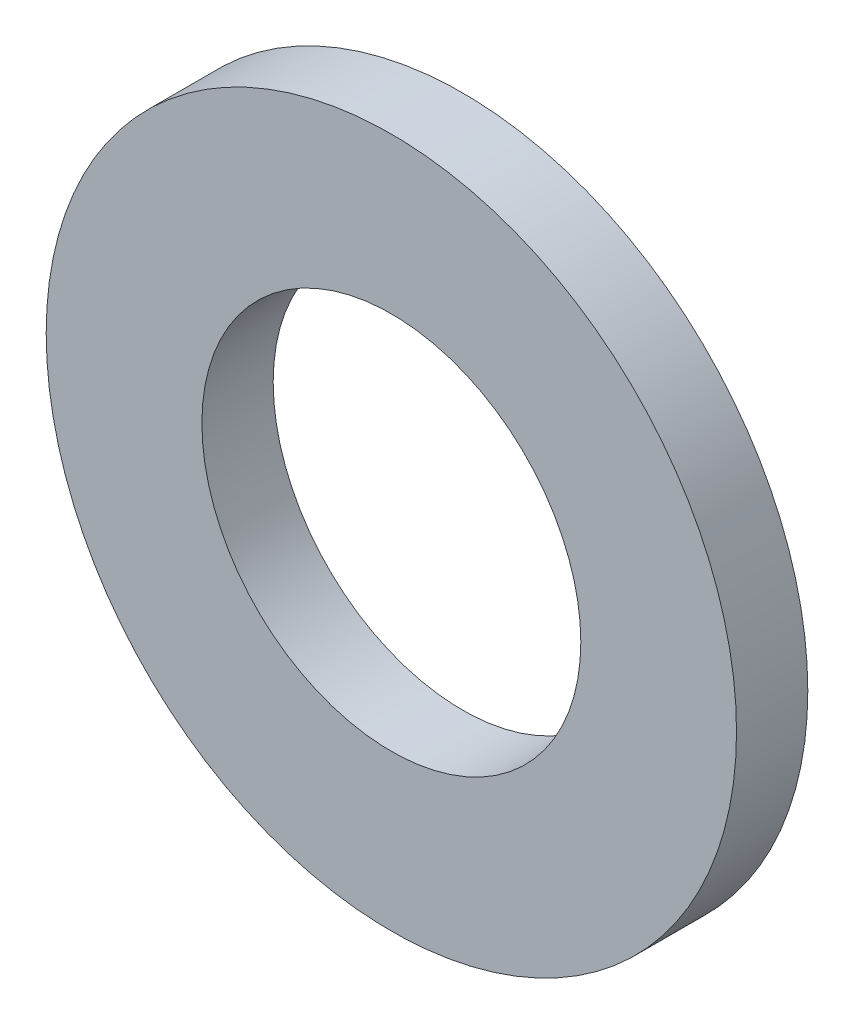
ISO-10303-21;
HEADER;
FILE_DESCRIPTION(('STEP AP214'),'2;1');
FILE_NAME('part.step','',(''),(''),'','','');
FILE_SCHEMA(('AUTOMOTIVE_DESIGN { 1 0 10303 214 1 1 1 1 }'));
ENDSEC;
DATA;
#1=APPLICATION_CONTEXT('core data for automotive mechanical design processes');
#2=APPLICATION_PROTOCOL_DEFINITION('international standard','automotive_design',2000,#1);
#3=PRODUCT_CONTEXT('',#1,'mechanical');
#4=PRODUCT('Part','Part','',(#3));
#5=PRODUCT_RELATED_PRODUCT_CATEGORY('part','',(#4));
#6=PRODUCT_DEFINITION_FORMATION('','',#4);
#7=PRODUCT_DEFINITION_CONTEXT('part definition',#1,'design');
#8=PRODUCT_DEFINITION('design','',#6,#7);
#9=PRODUCT_DEFINITION_SHAPE('','',#8);
#10=(LENGTH_UNIT() NAMED_UNIT(*) SI_UNIT(.MILLI.,.METRE.));
#11=(NAMED_UNIT(*) PLANE_ANGLE_UNIT() SI_UNIT($,.RADIAN.));
#12=(NAMED_UNIT(*) SI_UNIT($,.STERADIAN.) SOLID_ANGLE_UNIT());
#13=UNCERTAINTY_MEASURE_WITH_UNIT(LENGTH_MEASURE(1.E-05),#10,'distance_accuracy_value','');
#14=(GEOMETRIC_REPRESENTATION_CONTEXT(3) GLOBAL_UNCERTAINTY_ASSIGNED_CONTEXT((#13)) GLOBAL_UNIT_ASSIGNED_CONTEXT((#10,
#11,#12)) REPRESENTATION_CONTEXT('',''));
#15=CARTESIAN_POINT('',(0.,0.,0.));
#16=DIRECTION('',(0.,0.,1.));
#17=DIRECTION('',(1.,0.,0.));
#18=AXIS2_PLACEMENT_3D('',#15,#16,#17);
#19=CARTESIAN_POINT('',(0.,0.,0.57));
#20=DIRECTION('',(0.,0.,1.));
#21=DIRECTION('',(1.,0.,0.));
#22=AXIS2_PLACEMENT_3D('',#19,#20,#21);
#23=PLANE('',#22);
#24=CARTESIAN_POINT('',(0.,0.,0.57));
#25=DIRECTION('',(0.,0.,1.));
#26=DIRECTION('',(1.,0.,0.));
#27=AXIS2_PLACEMENT_3D('',#24,#25,#26);
#28=CIRCLE('',#27,2.76);
#29=CARTESIAN_POINT('',(2.76,0.,0.57));
#30=VERTEX_POINT('',#29);
#31=EDGE_CURVE('E10',#30,#30,#28,.T.);
#32=ORIENTED_EDGE('',*,*,#31,.T.);
#33=EDGE_LOOP('',(#32));
#34=FACE_BOUND('',#33,.T.);
#35=CARTESIAN_POINT('',(0.,0.,0.57));
#36=DIRECTION('',(0.,0.,1.));
#37=DIRECTION('',(1.,0.,0.));
#38=AXIS2_PLACEMENT_3D('',#35,#36,#37);
#39=CIRCLE('',#38,1.515);
#40=CARTESIAN_POINT('',(1.515,0.,0.57));
#41=VERTEX_POINT('',#40);
#42=EDGE_CURVE('E43',#41,#41,#39,.T.);
#43=ORIENTED_EDGE('',*,*,#42,.F.);
#44=EDGE_LOOP('',(#43));
#45=FACE_BOUND('',#44,.T.);
#46=ADVANCED_FACE('F32',(#34,#45),#23,.T.);
#47=CARTESIAN_POINT('',(0.,0.,0.));
#48=DIRECTION('',(0.,0.,1.));
#49=DIRECTION('',(1.,0.,0.));
#50=AXIS2_PLACEMENT_3D('',#47,#48,#49);
#51=PLANE('',#50);
#52=CARTESIAN_POINT('',(0.,0.,0.));
#53=DIRECTION('',(0.,0.,1.));
#54=DIRECTION('',(1.,0.,0.));
#55=AXIS2_PLACEMENT_3D('',#52,#53,#54);
#56=CIRCLE('',#55,2.76);
#57=CARTESIAN_POINT('',(2.76,0.,0.));
#58=VERTEX_POINT('',#57);
#59=EDGE_CURVE('E36',#58,#58,#56,.T.);
#60=ORIENTED_EDGE('',*,*,#59,.F.);
#61=EDGE_LOOP('',(#60));
#62=FACE_BOUND('',#61,.T.);
#63=CARTESIAN_POINT('',(0.,0.,0.));
#64=DIRECTION('',(0.,0.,1.));
#65=DIRECTION('',(1.,0.,0.));
#66=AXIS2_PLACEMENT_3D('',#63,#64,#65);
#67=CIRCLE('',#66,1.515);
#68=CARTESIAN_POINT('',(1.515,0.,0.));
#69=VERTEX_POINT('',#68);
#70=EDGE_CURVE('E45',#69,#69,#67,.T.);
#71=ORIENTED_EDGE('',*,*,#70,.T.);
#72=EDGE_LOOP('',(#71));
#73=FACE_BOUND('',#72,.T.);
#74=ADVANCED_FACE('F55',(#62,#73),#51,.F.);
#75=CARTESIAN_POINT('',(0.,0.,0.57));
#76=DIRECTION('',(0.,0.,-1.));
#77=DIRECTION('',(-1.,0.,0.));
#78=AXIS2_PLACEMENT_3D('',#75,#76,#77);
#79=CYLINDRICAL_SURFACE('',#78,2.76);
#80=ORIENTED_EDGE('',*,*,#31,.F.);
#81=EDGE_LOOP('',(#80));
#82=FACE_BOUND('',#81,.T.);
#83=ORIENTED_EDGE('',*,*,#59,.T.);
#84=EDGE_LOOP('',(#83));
#85=FACE_BOUND('',#84,.T.);
#86=ADVANCED_FACE('F34',(#82,#85),#79,.T.);
#87=CARTESIAN_POINT('',(0.,0.,0.57));
#88=DIRECTION('',(0.,0.,-1.));
#89=DIRECTION('',(-1.,0.,0.));
#90=AXIS2_PLACEMENT_3D('',#87,#88,#89);
#91=CYLINDRICAL_SURFACE('',#90,1.515);
#92=ORIENTED_EDGE('',*,*,#42,.T.);
#93=EDGE_LOOP('',(#92));
#94=FACE_BOUND('',#93,.T.);
#95=ORIENTED_EDGE('',*,*,#70,.F.);
#96=EDGE_LOOP('',(#95));
#97=FACE_BOUND('',#96,.T.);
#98=ADVANCED_FACE('F51',(#94,#97),#91,.F.);
#99=CLOSED_SHELL('',(#46,#74,#86,#98));
#100=MANIFOLD_SOLID_BREP('B2',#99);
#101=ADVANCED_BREP_SHAPE_REPRESENTATION('',(#18,#100),#14);
#102=SHAPE_DEFINITION_REPRESENTATION(#9,#101);
ENDSEC;
END-ISO-10303-21;
